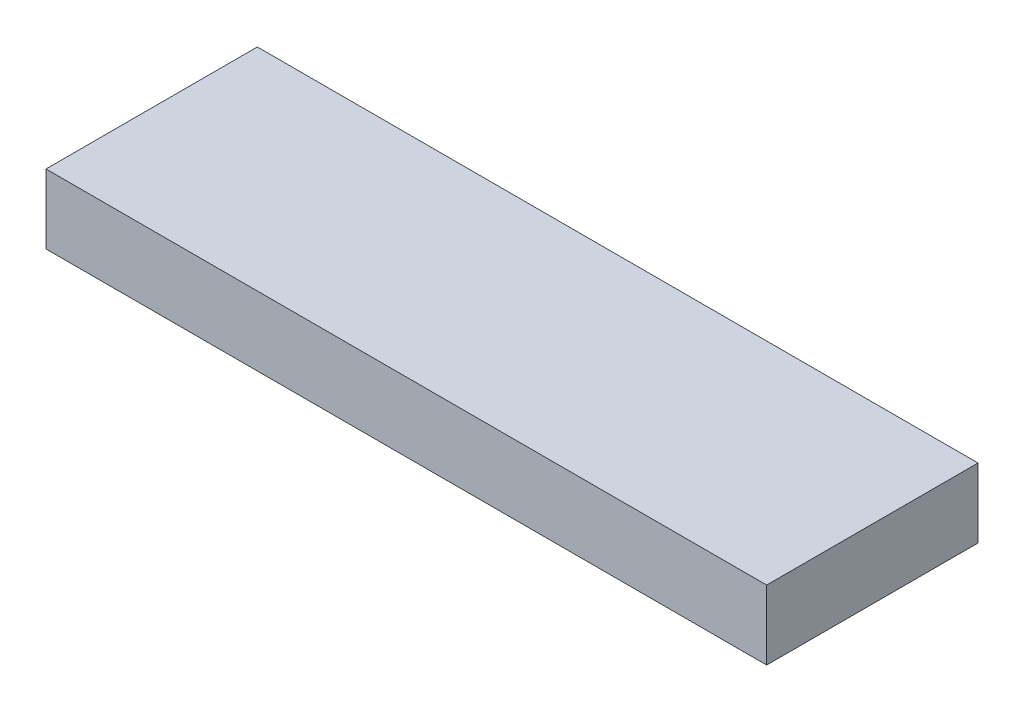
ISO-10303-21;
HEADER;
FILE_DESCRIPTION(('STEP AP214'),'2;1');
FILE_NAME('part.step','',(''),(''),'','','');
FILE_SCHEMA(('AUTOMOTIVE_DESIGN { 1 0 10303 214 1 1 1 1 }'));
ENDSEC;
DATA;
#1=APPLICATION_CONTEXT('core data for automotive mechanical design processes');
#2=APPLICATION_PROTOCOL_DEFINITION('international standard','automotive_design',2000,#1);
#3=PRODUCT_CONTEXT('',#1,'mechanical');
#4=PRODUCT('Part','Part','',(#3));
#5=PRODUCT_RELATED_PRODUCT_CATEGORY('part','',(#4));
#6=PRODUCT_DEFINITION_FORMATION('','',#4);
#7=PRODUCT_DEFINITION_CONTEXT('part definition',#1,'design');
#8=PRODUCT_DEFINITION('design','',#6,#7);
#9=PRODUCT_DEFINITION_SHAPE('','',#8);
#10=(LENGTH_UNIT() NAMED_UNIT(*) SI_UNIT(.MILLI.,.METRE.));
#11=(NAMED_UNIT(*) PLANE_ANGLE_UNIT() SI_UNIT($,.RADIAN.));
#12=(NAMED_UNIT(*) SI_UNIT($,.STERADIAN.) SOLID_ANGLE_UNIT());
#13=UNCERTAINTY_MEASURE_WITH_UNIT(LENGTH_MEASURE(1.E-05),#10,'distance_accuracy_value','');
#14=(GEOMETRIC_REPRESENTATION_CONTEXT(3) GLOBAL_UNCERTAINTY_ASSIGNED_CONTEXT((#13)) GLOBAL_UNIT_ASSIGNED_CONTEXT((#10,
#11,#12)) REPRESENTATION_CONTEXT('',''));
#15=CARTESIAN_POINT('',(0.,0.,0.));
#16=DIRECTION('',(0.,0.,1.));
#17=DIRECTION('',(1.,0.,0.));
#18=AXIS2_PLACEMENT_3D('',#15,#16,#17);
#19=CARTESIAN_POINT('',(104.,20.,-30.5));
#20=DIRECTION('',(-1.,0.,0.));
#21=DIRECTION('',(0.,0.,1.));
#22=AXIS2_PLACEMENT_3D('',#19,#20,#21);
#23=PLANE('',#22);
#24=DIRECTION('',(0.,0.,-1.));
#25=VECTOR('',#24,1.);
#26=CARTESIAN_POINT('',(104.,0.,-30.5));
#27=LINE('',#26,#25);
#28=CARTESIAN_POINT('',(104.,0.,30.5));
#29=VERTEX_POINT('',#28);
#30=CARTESIAN_POINT('',(104.,0.,-30.5));
#31=VERTEX_POINT('',#30);
#32=EDGE_CURVE('E99',#29,#31,#27,.T.);
#33=ORIENTED_EDGE('',*,*,#32,.T.);
#34=DIRECTION('',(0.,-1.,0.));
#35=VECTOR('',#34,1.);
#36=CARTESIAN_POINT('',(104.,20.,-30.5));
#37=LINE('',#36,#35);
#38=CARTESIAN_POINT('',(104.,20.,-30.5));
#39=VERTEX_POINT('',#38);
#40=EDGE_CURVE('E11',#39,#31,#37,.T.);
#41=ORIENTED_EDGE('',*,*,#40,.F.);
#42=DIRECTION('',(0.,0.,-1.));
#43=VECTOR('',#42,1.);
#44=CARTESIAN_POINT('',(104.,20.,-30.5));
#45=LINE('',#44,#43);
#46=CARTESIAN_POINT('',(104.,20.,30.5));
#47=VERTEX_POINT('',#46);
#48=EDGE_CURVE('E87',#47,#39,#45,.T.);
#49=ORIENTED_EDGE('',*,*,#48,.F.);
#50=DIRECTION('',(0.,-1.,0.));
#51=VECTOR('',#50,1.);
#52=CARTESIAN_POINT('',(104.,20.,30.5));
#53=LINE('',#52,#51);
#54=EDGE_CURVE('E95',#47,#29,#53,.T.);
#55=ORIENTED_EDGE('',*,*,#54,.T.);
#56=EDGE_LOOP('',(#33,#41,#49,#55));
#57=FACE_BOUND('',#56,.T.);
#58=ADVANCED_FACE('F36',(#57),#23,.F.);
#59=CARTESIAN_POINT('',(-104.,20.,-30.5));
#60=DIRECTION('',(0.,0.,1.));
#61=DIRECTION('',(1.,0.,0.));
#62=AXIS2_PLACEMENT_3D('',#59,#60,#61);
#63=PLANE('',#62);
#64=DIRECTION('',(-1.,0.,0.));
#65=VECTOR('',#64,1.);
#66=CARTESIAN_POINT('',(-104.,0.,-30.5));
#67=LINE('',#66,#65);
#68=CARTESIAN_POINT('',(-104.,0.,-30.5));
#69=VERTEX_POINT('',#68);
#70=EDGE_CURVE('E91',#31,#69,#67,.T.);
#71=ORIENTED_EDGE('',*,*,#70,.T.);
#72=DIRECTION('',(0.,-1.,0.));
#73=VECTOR('',#72,1.);
#74=CARTESIAN_POINT('',(-104.,20.,-30.5));
#75=LINE('',#74,#73);
#76=CARTESIAN_POINT('',(-104.,20.,-30.5));
#77=VERTEX_POINT('',#76);
#78=EDGE_CURVE('E44',#77,#69,#75,.T.);
#79=ORIENTED_EDGE('',*,*,#78,.F.);
#80=DIRECTION('',(-1.,0.,0.));
#81=VECTOR('',#80,1.);
#82=CARTESIAN_POINT('',(-104.,20.,-30.5));
#83=LINE('',#82,#81);
#84=EDGE_CURVE('E82',#39,#77,#83,.T.);
#85=ORIENTED_EDGE('',*,*,#84,.F.);
#86=ORIENTED_EDGE('',*,*,#40,.T.);
#87=EDGE_LOOP('',(#71,#79,#85,#86));
#88=FACE_BOUND('',#87,.T.);
#89=ADVANCED_FACE('F90',(#88),#63,.F.);
#90=CARTESIAN_POINT('',(-104.,20.,-30.5));
#91=DIRECTION('',(1.,0.,0.));
#92=DIRECTION('',(0.,0.,-1.));
#93=AXIS2_PLACEMENT_3D('',#90,#91,#92);
#94=PLANE('',#93);
#95=DIRECTION('',(0.,0.,1.));
#96=VECTOR('',#95,1.);
#97=CARTESIAN_POINT('',(-104.,0.,-30.5));
#98=LINE('',#97,#96);
#99=CARTESIAN_POINT('',(-104.,0.,30.5));
#100=VERTEX_POINT('',#99);
#101=EDGE_CURVE('E69',#69,#100,#98,.T.);
#102=ORIENTED_EDGE('',*,*,#101,.T.);
#103=DIRECTION('',(0.,-1.,0.));
#104=VECTOR('',#103,1.);
#105=CARTESIAN_POINT('',(-104.,20.,30.5));
#106=LINE('',#105,#104);
#107=CARTESIAN_POINT('',(-104.,20.,30.5));
#108=VERTEX_POINT('',#107);
#109=EDGE_CURVE('E92',#108,#100,#106,.T.);
#110=ORIENTED_EDGE('',*,*,#109,.F.);
#111=DIRECTION('',(0.,0.,1.));
#112=VECTOR('',#111,1.);
#113=CARTESIAN_POINT('',(-104.,20.,-30.5));
#114=LINE('',#113,#112);
#115=EDGE_CURVE('E85',#77,#108,#114,.T.);
#116=ORIENTED_EDGE('',*,*,#115,.F.);
#117=ORIENTED_EDGE('',*,*,#78,.T.);
#118=EDGE_LOOP('',(#102,#110,#116,#117));
#119=FACE_BOUND('',#118,.T.);
#120=ADVANCED_FACE('F93',(#119),#94,.F.);
#121=CARTESIAN_POINT('',(-104.,20.,30.5));
#122=DIRECTION('',(0.,0.,-1.));
#123=DIRECTION('',(-1.,0.,0.));
#124=AXIS2_PLACEMENT_3D('',#121,#122,#123);
#125=PLANE('',#124);
#126=DIRECTION('',(1.,0.,0.));
#127=VECTOR('',#126,1.);
#128=CARTESIAN_POINT('',(-104.,0.,30.5));
#129=LINE('',#128,#127);
#130=EDGE_CURVE('E75',#100,#29,#129,.T.);
#131=ORIENTED_EDGE('',*,*,#130,.T.);
#132=ORIENTED_EDGE('',*,*,#54,.F.);
#133=DIRECTION('',(1.,0.,0.));
#134=VECTOR('',#133,1.);
#135=CARTESIAN_POINT('',(-104.,20.,30.5));
#136=LINE('',#135,#134);
#137=EDGE_CURVE('E52',#108,#47,#136,.T.);
#138=ORIENTED_EDGE('',*,*,#137,.F.);
#139=ORIENTED_EDGE('',*,*,#109,.T.);
#140=EDGE_LOOP('',(#131,#132,#138,#139));
#141=FACE_BOUND('',#140,.T.);
#142=ADVANCED_FACE('F106',(#141),#125,.F.);
#143=CARTESIAN_POINT('',(0.,20.,0.));
#144=DIRECTION('',(0.,1.,0.));
#145=DIRECTION('',(0.,0.,1.));
#146=AXIS2_PLACEMENT_3D('',#143,#144,#145);
#147=PLANE('',#146);
#148=ORIENTED_EDGE('',*,*,#48,.T.);
#149=ORIENTED_EDGE('',*,*,#84,.T.);
#150=ORIENTED_EDGE('',*,*,#115,.T.);
#151=ORIENTED_EDGE('',*,*,#137,.T.);
#152=EDGE_LOOP('',(#148,#149,#150,#151));
#153=FACE_BOUND('',#152,.T.);
#154=ADVANCED_FACE('F83',(#153),#147,.T.);
#155=CARTESIAN_POINT('',(0.,0.,0.));
#156=DIRECTION('',(0.,1.,0.));
#157=DIRECTION('',(0.,0.,1.));
#158=AXIS2_PLACEMENT_3D('',#155,#156,#157);
#159=PLANE('',#158);
#160=ORIENTED_EDGE('',*,*,#32,.F.);
#161=ORIENTED_EDGE('',*,*,#130,.F.);
#162=ORIENTED_EDGE('',*,*,#101,.F.);
#163=ORIENTED_EDGE('',*,*,#70,.F.);
#164=EDGE_LOOP('',(#160,#161,#162,#163));
#165=FACE_BOUND('',#164,.T.);
#166=ADVANCED_FACE('F109',(#165),#159,.F.);
#167=CLOSED_SHELL('',(#58,#89,#120,#142,#154,#166));
#168=MANIFOLD_SOLID_BREP('B2',#167);
#169=ADVANCED_BREP_SHAPE_REPRESENTATION('',(#18,#168),#14);
#170=SHAPE_DEFINITION_REPRESENTATION(#9,#169);
ENDSEC;
END-ISO-10303-21;
